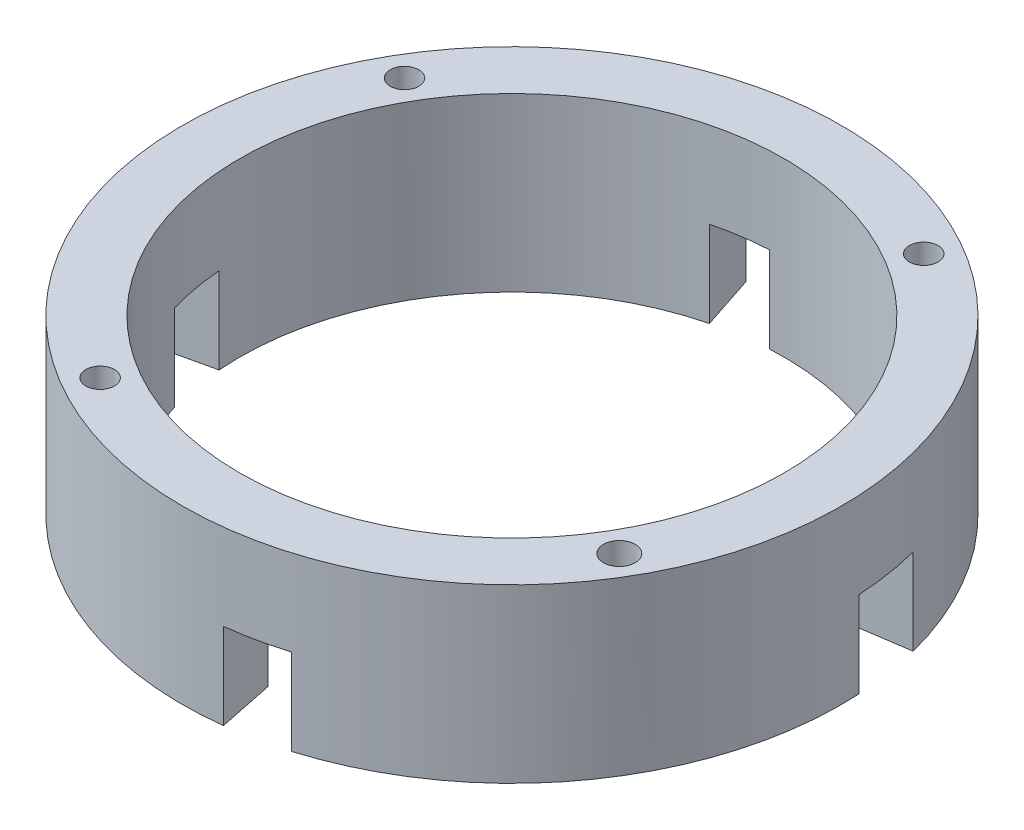
ISO-10303-21;
HEADER;
FILE_DESCRIPTION(('STEP AP214'),'2;1');
FILE_NAME('part.step','',(''),(''),'','','');
FILE_SCHEMA(('AUTOMOTIVE_DESIGN { 1 0 10303 214 1 1 1 1 }'));
ENDSEC;
DATA;
#1=APPLICATION_CONTEXT('core data for automotive mechanical design processes');
#2=APPLICATION_PROTOCOL_DEFINITION('international standard','automotive_design',2000,#1);
#3=PRODUCT_CONTEXT('',#1,'mechanical');
#4=PRODUCT('Part','Part','',(#3));
#5=PRODUCT_RELATED_PRODUCT_CATEGORY('part','',(#4));
#6=PRODUCT_DEFINITION_FORMATION('','',#4);
#7=PRODUCT_DEFINITION_CONTEXT('part definition',#1,'design');
#8=PRODUCT_DEFINITION('design','',#6,#7);
#9=PRODUCT_DEFINITION_SHAPE('','',#8);
#10=(LENGTH_UNIT() NAMED_UNIT(*) SI_UNIT(.MILLI.,.METRE.));
#11=(NAMED_UNIT(*) PLANE_ANGLE_UNIT() SI_UNIT($,.RADIAN.));
#12=(NAMED_UNIT(*) SI_UNIT($,.STERADIAN.) SOLID_ANGLE_UNIT());
#13=UNCERTAINTY_MEASURE_WITH_UNIT(LENGTH_MEASURE(1.E-05),#10,'distance_accuracy_value','');
#14=(GEOMETRIC_REPRESENTATION_CONTEXT(3) GLOBAL_UNCERTAINTY_ASSIGNED_CONTEXT((#13)) GLOBAL_UNIT_ASSIGNED_CONTEXT((#10,
#11,#12)) REPRESENTATION_CONTEXT('',''));
#15=CARTESIAN_POINT('',(0.,0.,0.));
#16=DIRECTION('',(0.,0.,1.));
#17=DIRECTION('',(1.,0.,0.));
#18=AXIS2_PLACEMENT_3D('',#15,#16,#17);
#19=CARTESIAN_POINT('',(0.,0.,0.));
#20=DIRECTION('',(0.,1.,0.));
#21=DIRECTION('',(0.,0.,1.));
#22=AXIS2_PLACEMENT_3D('',#19,#20,#21);
#23=PLANE('',#22);
#24=CARTESIAN_POINT('',(0.,0.,0.));
#25=DIRECTION('',(0.,1.,0.));
#26=DIRECTION('',(0.,0.,1.));
#27=AXIS2_PLACEMENT_3D('',#24,#25,#26);
#28=CIRCLE('',#27,47.5);
#29=CARTESIAN_POINT('',(14.579980257937,0.,45.2070146733687));
#30=VERTEX_POINT('',#29);
#31=CARTESIAN_POINT('',(47.4701334874566,0.,-1.68416943418851));
#32=VERTEX_POINT('',#31);
#33=EDGE_CURVE('E171',#30,#32,#28,.T.);
#34=ORIENTED_EDGE('',*,*,#33,.T.);
#35=DIRECTION('',(-0.989370126494567,0.,0.145419231190802));
#36=VECTOR('',#35,1.);
#37=CARTESIAN_POINT('',(42.7541895259545,0.,-0.991012316487418));
#38=LINE('',#37,#36);
#39=CARTESIAN_POINT('',(57.4138872991433,0.,-3.14571855086687));
#40=VERTEX_POINT('',#39);
#41=EDGE_CURVE('E162',#40,#32,#38,.T.);
#42=ORIENTED_EDGE('',*,*,#41,.F.);
#43=CARTESIAN_POINT('',(0.,0.,0.));
#44=DIRECTION('',(0.,1.,0.));
#45=DIRECTION('',(0.,0.,1.));
#46=AXIS2_PLACEMENT_3D('',#43,#44,#45);
#47=CIRCLE('',#46,57.5);
#48=CARTESIAN_POINT('',(16.6113611292367,0.,55.0482759169993));
#49=VERTEX_POINT('',#48);
#50=EDGE_CURVE('E184',#49,#40,#47,.T.);
#51=ORIENTED_EDGE('',*,*,#50,.F.);
#52=DIRECTION('',(0.202153039128623,0.,0.979353944583398));
#53=VECTOR('',#52,1.);
#54=CARTESIAN_POINT('',(14.579980257937,0.,45.2070146733687));
#55=LINE('',#54,#53);
#56=EDGE_CURVE('E258',#30,#49,#55,.T.);
#57=ORIENTED_EDGE('',*,*,#56,.F.);
#58=EDGE_LOOP('',(#34,#42,#51,#57));
#59=FACE_BOUND('',#58,.T.);
#60=ADVANCED_FACE('F33',(#59),#23,.F.);
#61=CARTESIAN_POINT('',(55.6920113939055,0.,-14.3055886597197));
#62=VERTEX_POINT('',#61);
#63=CARTESIAN_POINT('',(-5.75164713069226,0.,-57.2116120668173));
#64=VERTEX_POINT('',#63);
#65=EDGE_CURVE('E161',#62,#64,#47,.T.);
#66=ORIENTED_EDGE('',*,*,#65,.F.);
#67=DIRECTION('',(0.989370126494567,0.,-0.145419231190802));
#68=VECTOR('',#67,1.);
#69=CARTESIAN_POINT('',(41.459271252528,0.,-12.2136373528505));
#70=LINE('',#69,#68);
#71=CARTESIAN_POINT('',(45.7312251202783,0.,-12.8415360840684));
#72=VERTEX_POINT('',#71);
#73=EDGE_CURVE('E147',#72,#62,#70,.T.);
#74=ORIENTED_EDGE('',*,*,#73,.F.);
#75=CARTESIAN_POINT('',(-2.52841668344299,0.,-47.4326586760102));
#76=VERTEX_POINT('',#75);
#77=EDGE_CURVE('E159',#72,#76,#28,.T.);
#78=ORIENTED_EDGE('',*,*,#77,.T.);
#79=DIRECTION('',(0.313042502474321,0.,0.94973911767633));
#80=VECTOR('',#79,1.);
#81=CARTESIAN_POINT('',(-1.07171785929615,0.,-43.0131825824122));
#82=LINE('',#81,#80);
#83=EDGE_CURVE('E221',#64,#76,#82,.T.);
#84=ORIENTED_EDGE('',*,*,#83,.F.);
#85=EDGE_LOOP('',(#66,#74,#78,#84));
#86=FACE_BOUND('',#85,.T.);
#87=ADVANCED_FACE('F157',(#86),#23,.F.);
#88=CARTESIAN_POINT('',(-14.7396314277473,0.,-55.5787123400153));
#89=VERTEX_POINT('',#88);
#90=CARTESIAN_POINT('',(-57.189992363675,0.,5.96278235749017));
#91=VERTEX_POINT('',#90);
#92=EDGE_CURVE('E331',#89,#91,#47,.T.);
#93=ORIENTED_EDGE('',*,*,#92,.F.);
#94=DIRECTION('',(-0.313042502474321,0.,-0.94973911767633));
#95=VECTOR('',#94,1.);
#96=CARTESIAN_POINT('',(-10.0915286447718,0.,-41.4768411848861));
#97=LINE('',#96,#95);
#98=CARTESIAN_POINT('',(-11.6025614842852,0.,-46.0611611556133));
#99=VERTEX_POINT('',#98);
#100=EDGE_CURVE('E217',#99,#89,#97,.T.);
#101=ORIENTED_EDGE('',*,*,#100,.F.);
#102=CARTESIAN_POINT('',(-47.352562079798,0.,3.7396342707383));
#103=VERTEX_POINT('',#102);
#104=EDGE_CURVE('E172',#99,#103,#28,.T.);
#105=ORIENTED_EDGE('',*,*,#104,.T.);
#106=DIRECTION('',(0.975402794084519,0.,-0.220430009962603));
#107=VECTOR('',#106,1.);
#108=CARTESIAN_POINT('',(-38.9182178757552,0.,1.83356778394897));
#109=LINE('',#108,#107);
#110=EDGE_CURVE('E239',#91,#103,#109,.T.);
#111=ORIENTED_EDGE('',*,*,#110,.F.);
#112=EDGE_LOOP('',(#93,#101,#105,#111));
#113=FACE_BOUND('',#112,.T.);
#114=ADVANCED_FACE('F315',(#113),#23,.F.);
#115=CARTESIAN_POINT('',(0.,30.,0.));
#116=DIRECTION('',(0.,1.,0.));
#117=DIRECTION('',(0.,0.,1.));
#118=AXIS2_PLACEMENT_3D('',#115,#116,#117);
#119=PLANE('',#118);
#120=CARTESIAN_POINT('',(26.5545961803708,30.,-45.2891093056315));
#121=DIRECTION('',(0.,1.,0.));
#122=DIRECTION('',(0.,0.,1.));
#123=AXIS2_PLACEMENT_3D('',#120,#121,#122);
#124=CIRCLE('',#123,2.5);
#125=CARTESIAN_POINT('',(26.5545961803708,30.,-42.7891093056315));
#126=VERTEX_POINT('',#125);
#127=EDGE_CURVE('E517',#126,#126,#124,.T.);
#128=ORIENTED_EDGE('',*,*,#127,.F.);
#129=EDGE_LOOP('',(#128));
#130=FACE_BOUND('',#129,.T.);
#131=CARTESIAN_POINT('',(-26.5545961803707,30.,45.2891093056315));
#132=DIRECTION('',(0.,1.,0.));
#133=DIRECTION('',(0.,0.,1.));
#134=AXIS2_PLACEMENT_3D('',#131,#132,#133);
#135=CIRCLE('',#134,2.5);
#136=CARTESIAN_POINT('',(-26.5545961803707,30.,47.7891093056315));
#137=VERTEX_POINT('',#136);
#138=EDGE_CURVE('E525',#137,#137,#135,.T.);
#139=ORIENTED_EDGE('',*,*,#138,.F.);
#140=EDGE_LOOP('',(#139));
#141=FACE_BOUND('',#140,.T.);
#142=CARTESIAN_POINT('',(45.2891093056315,30.,26.5545961803707));
#143=DIRECTION('',(0.,1.,0.));
#144=DIRECTION('',(0.,0.,1.));
#145=AXIS2_PLACEMENT_3D('',#142,#143,#144);
#146=CIRCLE('',#145,2.77694908707375);
#147=CARTESIAN_POINT('',(45.2891093056315,30.,29.3315452674445));
#148=VERTEX_POINT('',#147);
#149=EDGE_CURVE('E531',#148,#148,#146,.T.);
#150=ORIENTED_EDGE('',*,*,#149,.F.);
#151=EDGE_LOOP('',(#150));
#152=FACE_BOUND('',#151,.T.);
#153=CARTESIAN_POINT('',(-45.2891093056315,30.,-26.5545961803708));
#154=DIRECTION('',(0.,1.,0.));
#155=DIRECTION('',(0.,0.,1.));
#156=AXIS2_PLACEMENT_3D('',#153,#154,#155);
#157=CIRCLE('',#156,2.5);
#158=CARTESIAN_POINT('',(-45.2891093056315,30.,-24.0545961803708));
#159=VERTEX_POINT('',#158);
#160=EDGE_CURVE('E537',#159,#159,#157,.T.);
#161=ORIENTED_EDGE('',*,*,#160,.F.);
#162=EDGE_LOOP('',(#161));
#163=FACE_BOUND('',#162,.T.);
#164=CARTESIAN_POINT('',(0.,30.,0.));
#165=DIRECTION('',(0.,1.,0.));
#166=DIRECTION('',(0.,0.,1.));
#167=AXIS2_PLACEMENT_3D('',#164,#165,#166);
#168=CIRCLE('',#167,57.5);
#169=CARTESIAN_POINT('',(0.,30.,57.5));
#170=VERTEX_POINT('',#169);
#171=EDGE_CURVE('E180',#170,#170,#168,.T.);
#172=ORIENTED_EDGE('',*,*,#171,.T.);
#173=EDGE_LOOP('',(#172));
#174=FACE_BOUND('',#173,.T.);
#175=CARTESIAN_POINT('',(0.,30.,0.));
#176=DIRECTION('',(0.,1.,0.));
#177=DIRECTION('',(0.,0.,1.));
#178=AXIS2_PLACEMENT_3D('',#175,#176,#177);
#179=CIRCLE('',#178,47.5);
#180=CARTESIAN_POINT('',(0.,30.,47.5));
#181=VERTEX_POINT('',#180);
#182=EDGE_CURVE('E175',#181,#181,#179,.T.);
#183=ORIENTED_EDGE('',*,*,#182,.F.);
#184=EDGE_LOOP('',(#183));
#185=FACE_BOUND('',#184,.T.);
#186=ADVANCED_FACE('F318',(#130,#141,#152,#163,#174,#185),#119,.T.);
#187=CARTESIAN_POINT('',(-55.3974567092636,0.,15.4068747689226));
#188=VERTEX_POINT('',#187);
#189=CARTESIAN_POINT('',(6.77122477061407,0.,57.0999169448242));
#190=VERTEX_POINT('',#189);
#191=EDGE_CURVE('E187',#188,#190,#47,.T.);
#192=ORIENTED_EDGE('',*,*,#191,.F.);
#193=DIRECTION('',(-0.975402794084519,0.,0.220430009962603));
#194=VECTOR('',#193,1.);
#195=CARTESIAN_POINT('',(-37.9780502699846,0.,11.4702857430968));
#196=LINE('',#195,#194);
#197=CARTESIAN_POINT('',(-45.6292311235047,0.,13.1993661619714));
#198=VERTEX_POINT('',#197);
#199=EDGE_CURVE('E234',#198,#188,#196,.T.);
#200=ORIENTED_EDGE('',*,*,#199,.F.);
#201=CARTESIAN_POINT('',(4.74070684395444,0.,47.2628363370173));
#202=VERTEX_POINT('',#201);
#203=EDGE_CURVE('E176',#198,#202,#28,.T.);
#204=ORIENTED_EDGE('',*,*,#203,.T.);
#205=DIRECTION('',(-0.202153039128623,0.,-0.979353944583398));
#206=VECTOR('',#205,1.);
#207=CARTESIAN_POINT('',(4.74070684395444,0.,47.2628363370173));
#208=LINE('',#207,#206);
#209=EDGE_CURVE('E253',#190,#202,#208,.T.);
#210=ORIENTED_EDGE('',*,*,#209,.F.);
#211=EDGE_LOOP('',(#192,#200,#204,#210));
#212=FACE_BOUND('',#211,.T.);
#213=ADVANCED_FACE('F282',(#212),#23,.F.);
#214=CARTESIAN_POINT('',(0.,30.,0.));
#215=DIRECTION('',(0.,-1.,0.));
#216=DIRECTION('',(0.,0.,-1.));
#217=AXIS2_PLACEMENT_3D('',#214,#215,#216);
#218=CYLINDRICAL_SURFACE('',#217,57.5);
#219=ORIENTED_EDGE('',*,*,#50,.T.);
#220=DIRECTION('',(0.,-1.,0.));
#221=VECTOR('',#220,1.);
#222=CARTESIAN_POINT('',(57.4138872991433,30.,-3.14571855086687));
#223=LINE('',#222,#221);
#224=CARTESIAN_POINT('',(57.4138872991433,15.,-3.14571855086687));
#225=VERTEX_POINT('',#224);
#226=EDGE_CURVE('E210',#40,#225,#223,.F.);
#227=ORIENTED_EDGE('',*,*,#226,.T.);
#228=CARTESIAN_POINT('',(0.,15.,0.));
#229=DIRECTION('',(0.,-1.,0.));
#230=DIRECTION('',(0.,0.,-1.));
#231=AXIS2_PLACEMENT_3D('',#228,#229,#230);
#232=CIRCLE('',#231,57.5);
#233=CARTESIAN_POINT('',(55.6920113939055,15.,-14.3055886597197));
#234=VERTEX_POINT('',#233);
#235=EDGE_CURVE('E204',#234,#225,#232,.T.);
#236=ORIENTED_EDGE('',*,*,#235,.F.);
#237=DIRECTION('',(0.,-1.,0.));
#238=VECTOR('',#237,1.);
#239=CARTESIAN_POINT('',(55.6920113939055,30.,-14.3055886597197));
#240=LINE('',#239,#238);
#241=EDGE_CURVE('E209',#234,#62,#240,.T.);
#242=ORIENTED_EDGE('',*,*,#241,.T.);
#243=ORIENTED_EDGE('',*,*,#65,.T.);
#244=DIRECTION('',(0.,-1.,0.));
#245=VECTOR('',#244,1.);
#246=CARTESIAN_POINT('',(-5.75164713069226,30.,-57.2116120668173));
#247=LINE('',#246,#245);
#248=CARTESIAN_POINT('',(-5.75164713069226,15.,-57.2116120668173));
#249=VERTEX_POINT('',#248);
#250=EDGE_CURVE('E231',#64,#249,#247,.F.);
#251=ORIENTED_EDGE('',*,*,#250,.T.);
#252=CARTESIAN_POINT('',(0.,15.,0.));
#253=DIRECTION('',(0.,1.,0.));
#254=DIRECTION('',(0.,0.,1.));
#255=AXIS2_PLACEMENT_3D('',#252,#253,#254);
#256=CIRCLE('',#255,57.5);
#257=CARTESIAN_POINT('',(-14.7396314277473,15.,-55.5787123400153));
#258=VERTEX_POINT('',#257);
#259=EDGE_CURVE('E223',#249,#258,#256,.T.);
#260=ORIENTED_EDGE('',*,*,#259,.T.);
#261=DIRECTION('',(0.,-1.,0.));
#262=VECTOR('',#261,1.);
#263=CARTESIAN_POINT('',(-14.7396314277473,30.,-55.5787123400153));
#264=LINE('',#263,#262);
#265=EDGE_CURVE('E228',#258,#89,#264,.T.);
#266=ORIENTED_EDGE('',*,*,#265,.T.);
#267=ORIENTED_EDGE('',*,*,#92,.T.);
#268=DIRECTION('',(0.,-1.,0.));
#269=VECTOR('',#268,1.);
#270=CARTESIAN_POINT('',(-57.189992363675,30.,5.96278235749017));
#271=LINE('',#270,#269);
#272=CARTESIAN_POINT('',(-57.189992363675,15.,5.96278235749017));
#273=VERTEX_POINT('',#272);
#274=EDGE_CURVE('E250',#91,#273,#271,.F.);
#275=ORIENTED_EDGE('',*,*,#274,.T.);
#276=CARTESIAN_POINT('',(0.,15.,0.));
#277=DIRECTION('',(0.,1.,0.));
#278=DIRECTION('',(0.,0.,1.));
#279=AXIS2_PLACEMENT_3D('',#276,#277,#278);
#280=CIRCLE('',#279,57.5);
#281=CARTESIAN_POINT('',(-55.3974567092636,15.,15.4068747689226));
#282=VERTEX_POINT('',#281);
#283=EDGE_CURVE('E241',#273,#282,#280,.T.);
#284=ORIENTED_EDGE('',*,*,#283,.T.);
#285=DIRECTION('',(0.,-1.,0.));
#286=VECTOR('',#285,1.);
#287=CARTESIAN_POINT('',(-55.3974567092636,30.,15.4068747689226));
#288=LINE('',#287,#286);
#289=EDGE_CURVE('E247',#282,#188,#288,.T.);
#290=ORIENTED_EDGE('',*,*,#289,.T.);
#291=ORIENTED_EDGE('',*,*,#191,.T.);
#292=DIRECTION('',(0.,-1.,0.));
#293=VECTOR('',#292,1.);
#294=CARTESIAN_POINT('',(6.77122477061406,30.,57.0999169448242));
#295=LINE('',#294,#293);
#296=CARTESIAN_POINT('',(6.77122477061407,15.,57.0999169448242));
#297=VERTEX_POINT('',#296);
#298=EDGE_CURVE('E274',#190,#297,#295,.F.);
#299=ORIENTED_EDGE('',*,*,#298,.T.);
#300=CARTESIAN_POINT('',(0.,15.,0.));
#301=DIRECTION('',(0.,1.,0.));
#302=DIRECTION('',(0.,0.,1.));
#303=AXIS2_PLACEMENT_3D('',#300,#301,#302);
#304=CIRCLE('',#303,57.5);
#305=CARTESIAN_POINT('',(16.6113611292367,15.,55.0482759169993));
#306=VERTEX_POINT('',#305);
#307=EDGE_CURVE('E267',#297,#306,#304,.T.);
#308=ORIENTED_EDGE('',*,*,#307,.T.);
#309=DIRECTION('',(0.,-1.,0.));
#310=VECTOR('',#309,1.);
#311=CARTESIAN_POINT('',(16.6113611292367,30.,55.0482759169993));
#312=LINE('',#311,#310);
#313=EDGE_CURVE('E272',#306,#49,#312,.T.);
#314=ORIENTED_EDGE('',*,*,#313,.T.);
#315=EDGE_LOOP('',(#219,#227,#236,#242,#243,#251,#260,#266,#267,#275,#284,#290,#291,#299,#308,#314));
#316=FACE_BOUND('',#315,.T.);
#317=ORIENTED_EDGE('',*,*,#171,.F.);
#318=EDGE_LOOP('',(#317));
#319=FACE_BOUND('',#318,.T.);
#320=ADVANCED_FACE('F35',(#316,#319),#218,.T.);
#321=CARTESIAN_POINT('',(0.,30.,0.));
#322=DIRECTION('',(0.,-1.,0.));
#323=DIRECTION('',(0.,0.,-1.));
#324=AXIS2_PLACEMENT_3D('',#321,#322,#323);
#325=CYLINDRICAL_SURFACE('',#324,47.5);
#326=DIRECTION('',(0.,-1.,0.));
#327=VECTOR('',#326,1.);
#328=CARTESIAN_POINT('',(47.4701334874566,30.,-1.68416943418851));
#329=LINE('',#328,#327);
#330=CARTESIAN_POINT('',(47.4701334874566,15.,-1.68416943418851));
#331=VERTEX_POINT('',#330);
#332=EDGE_CURVE('E11',#32,#331,#329,.F.);
#333=ORIENTED_EDGE('',*,*,#332,.F.);
#334=ORIENTED_EDGE('',*,*,#33,.F.);
#335=DIRECTION('',(0.,-1.,0.));
#336=VECTOR('',#335,1.);
#337=CARTESIAN_POINT('',(14.579980257937,15.,45.2070146733687));
#338=LINE('',#337,#336);
#339=CARTESIAN_POINT('',(14.579980257937,15.,45.2070146733687));
#340=VERTEX_POINT('',#339);
#341=EDGE_CURVE('E265',#340,#30,#338,.T.);
#342=ORIENTED_EDGE('',*,*,#341,.F.);
#343=CARTESIAN_POINT('',(0.,15.,0.));
#344=DIRECTION('',(0.,1.,0.));
#345=DIRECTION('',(0.,0.,1.));
#346=AXIS2_PLACEMENT_3D('',#343,#344,#345);
#347=CIRCLE('',#346,47.5);
#348=CARTESIAN_POINT('',(4.74070684395438,15.,47.2628363370173));
#349=VERTEX_POINT('',#348);
#350=EDGE_CURVE('E183',#349,#340,#347,.T.);
#351=ORIENTED_EDGE('',*,*,#350,.F.);
#352=DIRECTION('',(0.,-1.,0.));
#353=VECTOR('',#352,1.);
#354=CARTESIAN_POINT('',(4.74070684395444,15.,47.2628363370173));
#355=LINE('',#354,#353);
#356=EDGE_CURVE('E261',#349,#202,#355,.T.);
#357=ORIENTED_EDGE('',*,*,#356,.T.);
#358=ORIENTED_EDGE('',*,*,#203,.F.);
#359=DIRECTION('',(0.,-1.,0.));
#360=VECTOR('',#359,1.);
#361=CARTESIAN_POINT('',(-45.6292311235047,30.,13.1993661619714));
#362=LINE('',#361,#360);
#363=CARTESIAN_POINT('',(-45.6292311235047,15.,13.1993661619714));
#364=VERTEX_POINT('',#363);
#365=EDGE_CURVE('E191',#364,#198,#362,.T.);
#366=ORIENTED_EDGE('',*,*,#365,.F.);
#367=CARTESIAN_POINT('',(0.,15.,0.));
#368=DIRECTION('',(0.,1.,0.));
#369=DIRECTION('',(0.,0.,1.));
#370=AXIS2_PLACEMENT_3D('',#367,#368,#369);
#371=CIRCLE('',#370,47.5);
#372=CARTESIAN_POINT('',(-47.352562079798,15.,3.7396342707383));
#373=VERTEX_POINT('',#372);
#374=EDGE_CURVE('E189',#373,#364,#371,.T.);
#375=ORIENTED_EDGE('',*,*,#374,.F.);
#376=DIRECTION('',(0.,-1.,0.));
#377=VECTOR('',#376,1.);
#378=CARTESIAN_POINT('',(-47.352562079798,30.,3.7396342707383));
#379=LINE('',#378,#377);
#380=EDGE_CURVE('E193',#103,#373,#379,.F.);
#381=ORIENTED_EDGE('',*,*,#380,.F.);
#382=ORIENTED_EDGE('',*,*,#104,.F.);
#383=DIRECTION('',(0.,-1.,0.));
#384=VECTOR('',#383,1.);
#385=CARTESIAN_POINT('',(-11.6025614842852,30.,-46.0611611556133));
#386=LINE('',#385,#384);
#387=CARTESIAN_POINT('',(-11.6025614842852,15.,-46.0611611556133));
#388=VERTEX_POINT('',#387);
#389=EDGE_CURVE('E198',#388,#99,#386,.T.);
#390=ORIENTED_EDGE('',*,*,#389,.F.);
#391=CARTESIAN_POINT('',(0.,15.,0.));
#392=DIRECTION('',(0.,1.,0.));
#393=DIRECTION('',(0.,0.,1.));
#394=AXIS2_PLACEMENT_3D('',#391,#392,#393);
#395=CIRCLE('',#394,47.5);
#396=CARTESIAN_POINT('',(-2.52841668344299,15.,-47.4326586760102));
#397=VERTEX_POINT('',#396);
#398=EDGE_CURVE('E196',#397,#388,#395,.T.);
#399=ORIENTED_EDGE('',*,*,#398,.F.);
#400=DIRECTION('',(0.,-1.,0.));
#401=VECTOR('',#400,1.);
#402=CARTESIAN_POINT('',(-2.52841668344299,30.,-47.4326586760102));
#403=LINE('',#402,#401);
#404=EDGE_CURVE('E170',#76,#397,#403,.F.);
#405=ORIENTED_EDGE('',*,*,#404,.F.);
#406=ORIENTED_EDGE('',*,*,#77,.F.);
#407=DIRECTION('',(0.,-1.,0.));
#408=VECTOR('',#407,1.);
#409=CARTESIAN_POINT('',(45.7312251202783,30.,-12.8415360840684));
#410=LINE('',#409,#408);
#411=CARTESIAN_POINT('',(45.7312251202783,15.,-12.8415360840684));
#412=VERTEX_POINT('',#411);
#413=EDGE_CURVE('E41',#412,#72,#410,.T.);
#414=ORIENTED_EDGE('',*,*,#413,.F.);
#415=CARTESIAN_POINT('',(0.,15.,0.));
#416=DIRECTION('',(0.,-1.,0.));
#417=DIRECTION('',(0.,0.,-1.));
#418=AXIS2_PLACEMENT_3D('',#415,#416,#417);
#419=CIRCLE('',#418,47.5);
#420=EDGE_CURVE('E154',#412,#331,#419,.T.);
#421=ORIENTED_EDGE('',*,*,#420,.T.);
#422=EDGE_LOOP('',(#333,#334,#342,#351,#357,#358,#366,#375,#381,#382,#390,#399,#405,#406,#414,#421));
#423=FACE_BOUND('',#422,.T.);
#424=ORIENTED_EDGE('',*,*,#182,.T.);
#425=EDGE_LOOP('',(#424));
#426=FACE_BOUND('',#425,.T.);
#427=ADVANCED_FACE('F167',(#423,#426),#325,.F.);
#428=CARTESIAN_POINT('',(4.74070684395444,15.,47.2628363370173));
#429=DIRECTION('',(-0.979353944583398,0.,0.202153039128623));
#430=DIRECTION('',(0.202153039128623,0.,0.979353944583398));
#431=AXIS2_PLACEMENT_3D('',#428,#429,#430);
#432=PLANE('',#431);
#433=ORIENTED_EDGE('',*,*,#209,.T.);
#434=ORIENTED_EDGE('',*,*,#356,.F.);
#435=DIRECTION('',(-0.202153039128623,0.,-0.979353944583398));
#436=VECTOR('',#435,1.);
#437=CARTESIAN_POINT('',(4.74070684395444,15.,47.2628363370173));
#438=LINE('',#437,#436);
#439=EDGE_CURVE('E254',#297,#349,#438,.T.);
#440=ORIENTED_EDGE('',*,*,#439,.F.);
#441=ORIENTED_EDGE('',*,*,#298,.F.);
#442=EDGE_LOOP('',(#433,#434,#440,#441));
#443=FACE_BOUND('',#442,.T.);
#444=ADVANCED_FACE('F285',(#443),#432,.F.);
#445=CARTESIAN_POINT('',(14.579980257937,15.,45.2070146733687));
#446=DIRECTION('',(0.979353944583398,0.,-0.202153039128623));
#447=DIRECTION('',(-0.202153039128623,0.,-0.979353944583398));
#448=AXIS2_PLACEMENT_3D('',#445,#446,#447);
#449=PLANE('',#448);
#450=DIRECTION('',(0.202153039128623,0.,0.979353944583398));
#451=VECTOR('',#450,1.);
#452=CARTESIAN_POINT('',(14.579980257937,15.,45.2070146733687));
#453=LINE('',#452,#451);
#454=EDGE_CURVE('E257',#340,#306,#453,.T.);
#455=ORIENTED_EDGE('',*,*,#454,.F.);
#456=ORIENTED_EDGE('',*,*,#341,.T.);
#457=ORIENTED_EDGE('',*,*,#56,.T.);
#458=ORIENTED_EDGE('',*,*,#313,.F.);
#459=EDGE_LOOP('',(#455,#456,#457,#458));
#460=FACE_BOUND('',#459,.T.);
#461=ADVANCED_FACE('F293',(#460),#449,.F.);
#462=CARTESIAN_POINT('',(0.,15.,0.));
#463=DIRECTION('',(0.,1.,0.));
#464=DIRECTION('',(0.,0.,1.));
#465=AXIS2_PLACEMENT_3D('',#462,#463,#464);
#466=PLANE('',#465);
#467=ORIENTED_EDGE('',*,*,#439,.T.);
#468=ORIENTED_EDGE('',*,*,#350,.T.);
#469=ORIENTED_EDGE('',*,*,#454,.T.);
#470=ORIENTED_EDGE('',*,*,#307,.F.);
#471=EDGE_LOOP('',(#467,#468,#469,#470));
#472=FACE_BOUND('',#471,.T.);
#473=ADVANCED_FACE('F291',(#472),#466,.F.);
#474=CARTESIAN_POINT('',(-38.9182178757552,15.,1.83356778394897));
#475=DIRECTION('',(-0.220430009962603,0.,-0.975402794084519));
#476=DIRECTION('',(-0.975402794084519,0.,0.220430009962603));
#477=AXIS2_PLACEMENT_3D('',#474,#475,#476);
#478=PLANE('',#477);
#479=ORIENTED_EDGE('',*,*,#110,.T.);
#480=ORIENTED_EDGE('',*,*,#380,.T.);
#481=DIRECTION('',(0.975402794084519,0.,-0.220430009962603));
#482=VECTOR('',#481,1.);
#483=CARTESIAN_POINT('',(-38.9182178757552,15.,1.83356778394897));
#484=LINE('',#483,#482);
#485=EDGE_CURVE('E238',#273,#373,#484,.T.);
#486=ORIENTED_EDGE('',*,*,#485,.F.);
#487=ORIENTED_EDGE('',*,*,#274,.F.);
#488=EDGE_LOOP('',(#479,#480,#486,#487));
#489=FACE_BOUND('',#488,.T.);
#490=ADVANCED_FACE('F348',(#489),#478,.F.);
#491=CARTESIAN_POINT('',(-37.9780502699846,15.,11.4702857430968));
#492=DIRECTION('',(0.220430009962603,0.,0.975402794084519));
#493=DIRECTION('',(0.975402794084519,0.,-0.220430009962603));
#494=AXIS2_PLACEMENT_3D('',#491,#492,#493);
#495=PLANE('',#494);
#496=DIRECTION('',(-0.975402794084519,0.,0.220430009962603));
#497=VECTOR('',#496,1.);
#498=CARTESIAN_POINT('',(-37.9780502699846,15.,11.4702857430968));
#499=LINE('',#498,#497);
#500=EDGE_CURVE('E235',#364,#282,#499,.T.);
#501=ORIENTED_EDGE('',*,*,#500,.F.);
#502=ORIENTED_EDGE('',*,*,#365,.T.);
#503=ORIENTED_EDGE('',*,*,#199,.T.);
#504=ORIENTED_EDGE('',*,*,#289,.F.);
#505=EDGE_LOOP('',(#501,#502,#503,#504));
#506=FACE_BOUND('',#505,.T.);
#507=ADVANCED_FACE('F349',(#506),#495,.F.);
#508=CARTESIAN_POINT('',(0.,15.,0.));
#509=DIRECTION('',(0.,1.,0.));
#510=DIRECTION('',(0.,0.,1.));
#511=AXIS2_PLACEMENT_3D('',#508,#509,#510);
#512=PLANE('',#511);
#513=ORIENTED_EDGE('',*,*,#485,.T.);
#514=ORIENTED_EDGE('',*,*,#374,.T.);
#515=ORIENTED_EDGE('',*,*,#500,.T.);
#516=ORIENTED_EDGE('',*,*,#283,.F.);
#517=EDGE_LOOP('',(#513,#514,#515,#516));
#518=FACE_BOUND('',#517,.T.);
#519=ADVANCED_FACE('F352',(#518),#512,.F.);
#520=CARTESIAN_POINT('',(-1.07171785929615,15.,-43.0131825824122));
#521=DIRECTION('',(0.94973911767633,0.,-0.313042502474321));
#522=DIRECTION('',(-0.313042502474321,0.,-0.94973911767633));
#523=AXIS2_PLACEMENT_3D('',#520,#521,#522);
#524=PLANE('',#523);
#525=ORIENTED_EDGE('',*,*,#83,.T.);
#526=ORIENTED_EDGE('',*,*,#404,.T.);
#527=DIRECTION('',(0.313042502474321,0.,0.94973911767633));
#528=VECTOR('',#527,1.);
#529=CARTESIAN_POINT('',(-1.07171785929615,15.,-43.0131825824122));
#530=LINE('',#529,#528);
#531=EDGE_CURVE('E55',#249,#397,#530,.T.);
#532=ORIENTED_EDGE('',*,*,#531,.F.);
#533=ORIENTED_EDGE('',*,*,#250,.F.);
#534=EDGE_LOOP('',(#525,#526,#532,#533));
#535=FACE_BOUND('',#534,.T.);
#536=ADVANCED_FACE('F359',(#535),#524,.F.);
#537=CARTESIAN_POINT('',(-10.0915286447718,15.,-41.4768411848861));
#538=DIRECTION('',(-0.94973911767633,0.,0.313042502474321));
#539=DIRECTION('',(0.313042502474321,0.,0.94973911767633));
#540=AXIS2_PLACEMENT_3D('',#537,#538,#539);
#541=PLANE('',#540);
#542=DIRECTION('',(-0.313042502474321,0.,-0.94973911767633));
#543=VECTOR('',#542,1.);
#544=CARTESIAN_POINT('',(-10.0915286447718,15.,-41.4768411848861));
#545=LINE('',#544,#543);
#546=EDGE_CURVE('E218',#388,#258,#545,.T.);
#547=ORIENTED_EDGE('',*,*,#546,.F.);
#548=ORIENTED_EDGE('',*,*,#389,.T.);
#549=ORIENTED_EDGE('',*,*,#100,.T.);
#550=ORIENTED_EDGE('',*,*,#265,.F.);
#551=EDGE_LOOP('',(#547,#548,#549,#550));
#552=FACE_BOUND('',#551,.T.);
#553=ADVANCED_FACE('F308',(#552),#541,.F.);
#554=CARTESIAN_POINT('',(0.,15.,0.));
#555=DIRECTION('',(0.,1.,0.));
#556=DIRECTION('',(0.,0.,1.));
#557=AXIS2_PLACEMENT_3D('',#554,#555,#556);
#558=PLANE('',#557);
#559=ORIENTED_EDGE('',*,*,#531,.T.);
#560=ORIENTED_EDGE('',*,*,#398,.T.);
#561=ORIENTED_EDGE('',*,*,#546,.T.);
#562=ORIENTED_EDGE('',*,*,#259,.F.);
#563=EDGE_LOOP('',(#559,#560,#561,#562));
#564=FACE_BOUND('',#563,.T.);
#565=ADVANCED_FACE('F301',(#564),#558,.F.);
#566=CARTESIAN_POINT('',(42.7541895259545,15.,-0.991012316487418));
#567=DIRECTION('',(0.145419231190802,0.,0.989370126494567));
#568=DIRECTION('',(0.989370126494567,0.,-0.145419231190802));
#569=AXIS2_PLACEMENT_3D('',#566,#567,#568);
#570=PLANE('',#569);
#571=ORIENTED_EDGE('',*,*,#41,.T.);
#572=ORIENTED_EDGE('',*,*,#332,.T.);
#573=DIRECTION('',(-0.989370126494567,0.,0.145419231190802));
#574=VECTOR('',#573,1.);
#575=CARTESIAN_POINT('',(42.7541895259545,15.,-0.991012316487418));
#576=LINE('',#575,#574);
#577=EDGE_CURVE('E48',#225,#331,#576,.T.);
#578=ORIENTED_EDGE('',*,*,#577,.F.);
#579=ORIENTED_EDGE('',*,*,#226,.F.);
#580=EDGE_LOOP('',(#571,#572,#578,#579));
#581=FACE_BOUND('',#580,.T.);
#582=ADVANCED_FACE('F299',(#581),#570,.F.);
#583=CARTESIAN_POINT('',(41.459271252528,15.,-12.2136373528505));
#584=DIRECTION('',(-0.145419231190802,0.,-0.989370126494567));
#585=DIRECTION('',(-0.989370126494567,0.,0.145419231190802));
#586=AXIS2_PLACEMENT_3D('',#583,#584,#585);
#587=PLANE('',#586);
#588=DIRECTION('',(0.989370126494567,0.,-0.145419231190802));
#589=VECTOR('',#588,1.);
#590=CARTESIAN_POINT('',(41.459271252528,15.,-12.2136373528505));
#591=LINE('',#590,#589);
#592=EDGE_CURVE('E150',#412,#234,#591,.T.);
#593=ORIENTED_EDGE('',*,*,#592,.F.);
#594=ORIENTED_EDGE('',*,*,#413,.T.);
#595=ORIENTED_EDGE('',*,*,#73,.T.);
#596=ORIENTED_EDGE('',*,*,#241,.F.);
#597=EDGE_LOOP('',(#593,#594,#595,#596));
#598=FACE_BOUND('',#597,.T.);
#599=ADVANCED_FACE('F146',(#598),#587,.F.);
#600=CARTESIAN_POINT('',(0.,15.,0.));
#601=DIRECTION('',(0.,-1.,0.));
#602=DIRECTION('',(0.,0.,-1.));
#603=AXIS2_PLACEMENT_3D('',#600,#601,#602);
#604=PLANE('',#603);
#605=ORIENTED_EDGE('',*,*,#235,.T.);
#606=ORIENTED_EDGE('',*,*,#577,.T.);
#607=ORIENTED_EDGE('',*,*,#420,.F.);
#608=ORIENTED_EDGE('',*,*,#592,.T.);
#609=EDGE_LOOP('',(#605,#606,#607,#608));
#610=FACE_BOUND('',#609,.T.);
#611=ADVANCED_FACE('F202',(#610),#604,.T.);
#612=CARTESIAN_POINT('',(-45.2891093056315,20.,-26.5545961803708));
#613=DIRECTION('',(0.,1.,0.));
#614=DIRECTION('',(0.,0.,1.));
#615=AXIS2_PLACEMENT_3D('',#612,#613,#614);
#616=CYLINDRICAL_SURFACE('',#615,2.5);
#617=CARTESIAN_POINT('',(-45.2891093056315,20.,-26.5545961803708));
#618=DIRECTION('',(0.,1.,0.));
#619=DIRECTION('',(0.,0.,1.));
#620=AXIS2_PLACEMENT_3D('',#617,#618,#619);
#621=CIRCLE('',#620,2.5);
#622=CARTESIAN_POINT('',(-45.2891093056315,20.,-24.0545961803708));
#623=VERTEX_POINT('',#622);
#624=EDGE_CURVE('E534',#623,#623,#621,.T.);
#625=ORIENTED_EDGE('',*,*,#624,.F.);
#626=EDGE_LOOP('',(#625));
#627=FACE_BOUND('',#626,.T.);
#628=ORIENTED_EDGE('',*,*,#160,.T.);
#629=EDGE_LOOP('',(#628));
#630=FACE_BOUND('',#629,.T.);
#631=ADVANCED_FACE('F427',(#627,#630),#616,.F.);
#632=CARTESIAN_POINT('',(-45.2891093056315,20.,-26.5545961803708));
#633=DIRECTION('',(0.,1.,0.));
#634=DIRECTION('',(0.,0.,1.));
#635=AXIS2_PLACEMENT_3D('',#632,#633,#634);
#636=PLANE('',#635);
#637=ORIENTED_EDGE('',*,*,#624,.T.);
#638=EDGE_LOOP('',(#637));
#639=FACE_BOUND('',#638,.T.);
#640=ADVANCED_FACE('F441',(#639),#636,.T.);
#641=CARTESIAN_POINT('',(45.2891093056315,20.,26.5545961803707));
#642=DIRECTION('',(0.,1.,0.));
#643=DIRECTION('',(0.,0.,1.));
#644=AXIS2_PLACEMENT_3D('',#641,#642,#643);
#645=CYLINDRICAL_SURFACE('',#644,2.77694908707375);
#646=CARTESIAN_POINT('',(45.2891093056315,20.,26.5545961803707));
#647=DIRECTION('',(0.,1.,0.));
#648=DIRECTION('',(0.,0.,1.));
#649=AXIS2_PLACEMENT_3D('',#646,#647,#648);
#650=CIRCLE('',#649,2.77694908707375);
#651=CARTESIAN_POINT('',(45.2891093056315,20.,29.3315452674445));
#652=VERTEX_POINT('',#651);
#653=EDGE_CURVE('E528',#652,#652,#650,.T.);
#654=ORIENTED_EDGE('',*,*,#653,.F.);
#655=EDGE_LOOP('',(#654));
#656=FACE_BOUND('',#655,.T.);
#657=ORIENTED_EDGE('',*,*,#149,.T.);
#658=EDGE_LOOP('',(#657));
#659=FACE_BOUND('',#658,.T.);
#660=ADVANCED_FACE('F451',(#656,#659),#645,.F.);
#661=CARTESIAN_POINT('',(45.2891093056315,20.,26.5545961803707));
#662=DIRECTION('',(0.,1.,0.));
#663=DIRECTION('',(0.,0.,1.));
#664=AXIS2_PLACEMENT_3D('',#661,#662,#663);
#665=PLANE('',#664);
#666=ORIENTED_EDGE('',*,*,#653,.T.);
#667=EDGE_LOOP('',(#666));
#668=FACE_BOUND('',#667,.T.);
#669=ADVANCED_FACE('F461',(#668),#665,.T.);
#670=CARTESIAN_POINT('',(-26.5545961803707,20.,45.2891093056315));
#671=DIRECTION('',(0.,1.,0.));
#672=DIRECTION('',(0.,0.,1.));
#673=AXIS2_PLACEMENT_3D('',#670,#671,#672);
#674=CYLINDRICAL_SURFACE('',#673,2.5);
#675=CARTESIAN_POINT('',(-26.5545961803707,20.,45.2891093056315));
#676=DIRECTION('',(0.,1.,0.));
#677=DIRECTION('',(0.,0.,1.));
#678=AXIS2_PLACEMENT_3D('',#675,#676,#677);
#679=CIRCLE('',#678,2.5);
#680=CARTESIAN_POINT('',(-26.5545961803707,20.,47.7891093056315));
#681=VERTEX_POINT('',#680);
#682=EDGE_CURVE('E520',#681,#681,#679,.T.);
#683=ORIENTED_EDGE('',*,*,#682,.F.);
#684=EDGE_LOOP('',(#683));
#685=FACE_BOUND('',#684,.T.);
#686=ORIENTED_EDGE('',*,*,#138,.T.);
#687=EDGE_LOOP('',(#686));
#688=FACE_BOUND('',#687,.T.);
#689=ADVANCED_FACE('F471',(#685,#688),#674,.F.);
#690=CARTESIAN_POINT('',(-26.5545961803707,20.,45.2891093056315));
#691=DIRECTION('',(0.,1.,0.));
#692=DIRECTION('',(0.,0.,1.));
#693=AXIS2_PLACEMENT_3D('',#690,#691,#692);
#694=PLANE('',#693);
#695=ORIENTED_EDGE('',*,*,#682,.T.);
#696=EDGE_LOOP('',(#695));
#697=FACE_BOUND('',#696,.T.);
#698=ADVANCED_FACE('F481',(#697),#694,.T.);
#699=CARTESIAN_POINT('',(26.5545961803708,20.,-45.2891093056315));
#700=DIRECTION('',(0.,1.,0.));
#701=DIRECTION('',(0.,0.,1.));
#702=AXIS2_PLACEMENT_3D('',#699,#700,#701);
#703=CYLINDRICAL_SURFACE('',#702,2.5);
#704=CARTESIAN_POINT('',(26.5545961803708,20.,-45.2891093056315));
#705=DIRECTION('',(0.,1.,0.));
#706=DIRECTION('',(0.,0.,1.));
#707=AXIS2_PLACEMENT_3D('',#704,#705,#706);
#708=CIRCLE('',#707,2.5);
#709=CARTESIAN_POINT('',(26.5545961803708,20.,-42.7891093056315));
#710=VERTEX_POINT('',#709);
#711=EDGE_CURVE('E163',#710,#710,#708,.T.);
#712=ORIENTED_EDGE('',*,*,#711,.F.);
#713=EDGE_LOOP('',(#712));
#714=FACE_BOUND('',#713,.T.);
#715=ORIENTED_EDGE('',*,*,#127,.T.);
#716=EDGE_LOOP('',(#715));
#717=FACE_BOUND('',#716,.T.);
#718=ADVANCED_FACE('F491',(#714,#717),#703,.F.);
#719=CARTESIAN_POINT('',(26.5545961803708,20.,-45.2891093056315));
#720=DIRECTION('',(0.,1.,0.));
#721=DIRECTION('',(0.,0.,1.));
#722=AXIS2_PLACEMENT_3D('',#719,#720,#721);
#723=PLANE('',#722);
#724=ORIENTED_EDGE('',*,*,#711,.T.);
#725=EDGE_LOOP('',(#724));
#726=FACE_BOUND('',#725,.T.);
#727=ADVANCED_FACE('F501',(#726),#723,.T.);
#728=CLOSED_SHELL('',(#60,#87,#114,#186,#213,#320,#427,#444,#461,#473,#490,#507,#519,#536,#553,
#565,#582,#599,#611,#631,#640,#660,#669,#689,#698,#718,#727));
#729=MANIFOLD_SOLID_BREP('B2',#728);
#730=ADVANCED_BREP_SHAPE_REPRESENTATION('',(#18,#729),#14);
#731=SHAPE_DEFINITION_REPRESENTATION(#9,#730);
ENDSEC;
END-ISO-10303-21;
